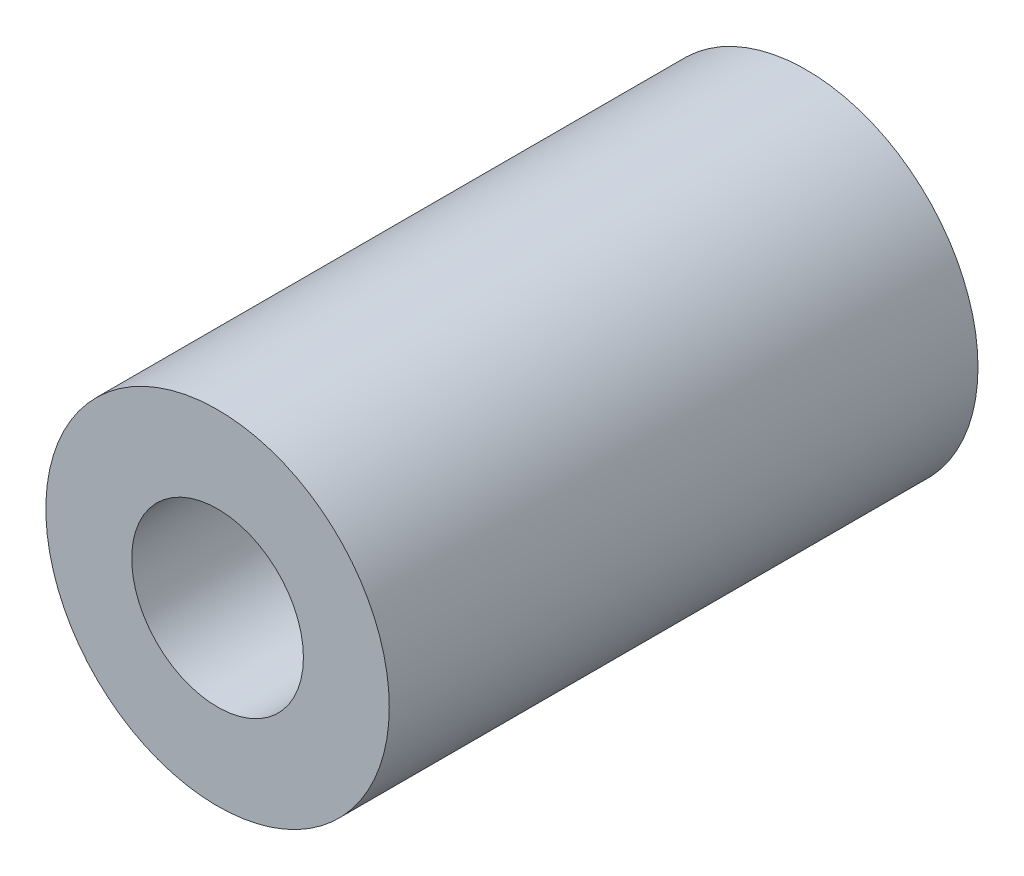
ISO-10303-21;
HEADER;
FILE_DESCRIPTION(('STEP AP214'),'2;1');
FILE_NAME('part.step','',(''),(''),'','','');
FILE_SCHEMA(('AUTOMOTIVE_DESIGN { 1 0 10303 214 1 1 1 1 }'));
ENDSEC;
DATA;
#1=APPLICATION_CONTEXT('core data for automotive mechanical design processes');
#2=APPLICATION_PROTOCOL_DEFINITION('international standard','automotive_design',2000,#1);
#3=PRODUCT_CONTEXT('',#1,'mechanical');
#4=PRODUCT('Part','Part','',(#3));
#5=PRODUCT_RELATED_PRODUCT_CATEGORY('part','',(#4));
#6=PRODUCT_DEFINITION_FORMATION('','',#4);
#7=PRODUCT_DEFINITION_CONTEXT('part definition',#1,'design');
#8=PRODUCT_DEFINITION('design','',#6,#7);
#9=PRODUCT_DEFINITION_SHAPE('','',#8);
#10=(LENGTH_UNIT() NAMED_UNIT(*) SI_UNIT(.MILLI.,.METRE.));
#11=(NAMED_UNIT(*) PLANE_ANGLE_UNIT() SI_UNIT($,.RADIAN.));
#12=(NAMED_UNIT(*) SI_UNIT($,.STERADIAN.) SOLID_ANGLE_UNIT());
#13=UNCERTAINTY_MEASURE_WITH_UNIT(LENGTH_MEASURE(1.E-05),#10,'distance_accuracy_value','');
#14=(GEOMETRIC_REPRESENTATION_CONTEXT(3) GLOBAL_UNCERTAINTY_ASSIGNED_CONTEXT((#13)) GLOBAL_UNIT_ASSIGNED_CONTEXT((#10,
#11,#12)) REPRESENTATION_CONTEXT('',''));
#15=CARTESIAN_POINT('',(0.,0.,0.));
#16=DIRECTION('',(0.,0.,1.));
#17=DIRECTION('',(1.,0.,0.));
#18=AXIS2_PLACEMENT_3D('',#15,#16,#17);
#19=CARTESIAN_POINT('',(0.,0.,12.));
#20=DIRECTION('',(0.,0.,1.));
#21=DIRECTION('',(1.,0.,0.));
#22=AXIS2_PLACEMENT_3D('',#19,#20,#21);
#23=PLANE('',#22);
#24=CARTESIAN_POINT('',(0.,0.,12.));
#25=DIRECTION('',(0.,0.,1.));
#26=DIRECTION('',(1.,0.,0.));
#27=AXIS2_PLACEMENT_3D('',#24,#25,#26);
#28=CIRCLE('',#27,3.5);
#29=CARTESIAN_POINT('',(3.5,0.,12.));
#30=VERTEX_POINT('',#29);
#31=EDGE_CURVE('E10',#30,#30,#28,.T.);
#32=ORIENTED_EDGE('',*,*,#31,.T.);
#33=EDGE_LOOP('',(#32));
#34=FACE_BOUND('',#33,.T.);
#35=CARTESIAN_POINT('',(0.,0.,12.));
#36=DIRECTION('',(0.,0.,1.));
#37=DIRECTION('',(1.,0.,0.));
#38=AXIS2_PLACEMENT_3D('',#35,#36,#37);
#39=CIRCLE('',#38,1.75);
#40=CARTESIAN_POINT('',(1.75,0.,12.));
#41=VERTEX_POINT('',#40);
#42=EDGE_CURVE('E50',#41,#41,#39,.T.);
#43=ORIENTED_EDGE('',*,*,#42,.F.);
#44=EDGE_LOOP('',(#43));
#45=FACE_BOUND('',#44,.T.);
#46=ADVANCED_FACE('F37',(#34,#45),#23,.T.);
#47=CARTESIAN_POINT('',(0.,0.,0.));
#48=DIRECTION('',(0.,0.,1.));
#49=DIRECTION('',(1.,0.,0.));
#50=AXIS2_PLACEMENT_3D('',#47,#48,#49);
#51=PLANE('',#50);
#52=CARTESIAN_POINT('',(0.,0.,0.));
#53=DIRECTION('',(0.,0.,1.));
#54=DIRECTION('',(1.,0.,0.));
#55=AXIS2_PLACEMENT_3D('',#52,#53,#54);
#56=CIRCLE('',#55,3.5);
#57=CARTESIAN_POINT('',(3.5,0.,0.));
#58=VERTEX_POINT('',#57);
#59=EDGE_CURVE('E41',#58,#58,#56,.T.);
#60=ORIENTED_EDGE('',*,*,#59,.F.);
#61=EDGE_LOOP('',(#60));
#62=FACE_BOUND('',#61,.T.);
#63=CARTESIAN_POINT('',(0.,0.,0.));
#64=DIRECTION('',(0.,0.,1.));
#65=DIRECTION('',(1.,0.,0.));
#66=AXIS2_PLACEMENT_3D('',#63,#64,#65);
#67=CIRCLE('',#66,1.75);
#68=CARTESIAN_POINT('',(1.75,0.,0.));
#69=VERTEX_POINT('',#68);
#70=EDGE_CURVE('E52',#69,#69,#67,.T.);
#71=ORIENTED_EDGE('',*,*,#70,.T.);
#72=EDGE_LOOP('',(#71));
#73=FACE_BOUND('',#72,.T.);
#74=ADVANCED_FACE('F64',(#62,#73),#51,.F.);
#75=CARTESIAN_POINT('',(0.,0.,12.));
#76=DIRECTION('',(0.,0.,-1.));
#77=DIRECTION('',(-1.,0.,0.));
#78=AXIS2_PLACEMENT_3D('',#75,#76,#77);
#79=CYLINDRICAL_SURFACE('',#78,3.5);
#80=ORIENTED_EDGE('',*,*,#31,.F.);
#81=EDGE_LOOP('',(#80));
#82=FACE_BOUND('',#81,.T.);
#83=ORIENTED_EDGE('',*,*,#59,.T.);
#84=EDGE_LOOP('',(#83));
#85=FACE_BOUND('',#84,.T.);
#86=ADVANCED_FACE('F39',(#82,#85),#79,.T.);
#87=CARTESIAN_POINT('',(0.,0.,12.));
#88=DIRECTION('',(0.,0.,-1.));
#89=DIRECTION('',(-1.,0.,0.));
#90=AXIS2_PLACEMENT_3D('',#87,#88,#89);
#91=CYLINDRICAL_SURFACE('',#90,1.75);
#92=ORIENTED_EDGE('',*,*,#42,.T.);
#93=EDGE_LOOP('',(#92));
#94=FACE_BOUND('',#93,.T.);
#95=ORIENTED_EDGE('',*,*,#70,.F.);
#96=EDGE_LOOP('',(#95));
#97=FACE_BOUND('',#96,.T.);
#98=ADVANCED_FACE('F60',(#94,#97),#91,.F.);
#99=CLOSED_SHELL('',(#46,#74,#86,#98));
#100=MANIFOLD_SOLID_BREP('B2',#99);
#101=ADVANCED_BREP_SHAPE_REPRESENTATION('',(#18,#100),#14);
#102=SHAPE_DEFINITION_REPRESENTATION(#9,#101);
ENDSEC;
END-ISO-10303-21;
